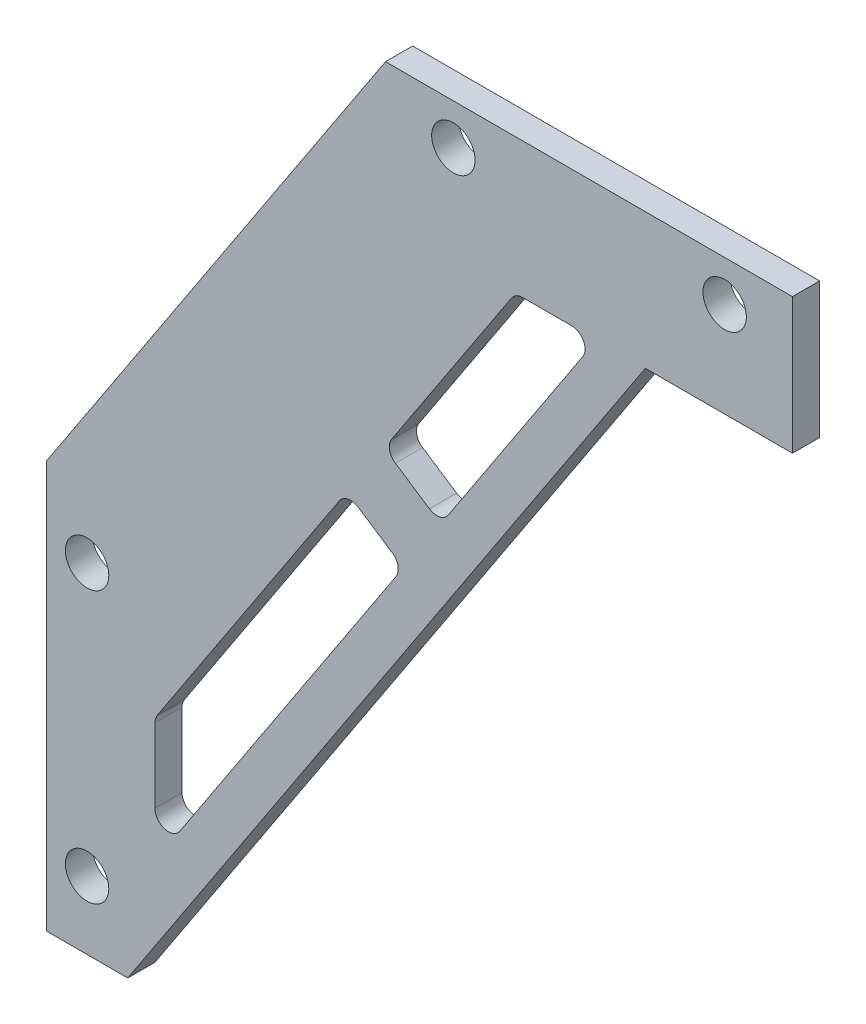
ISO-10303-21;
HEADER;
FILE_DESCRIPTION(('STEP AP214'),'2;1');
FILE_NAME('part.step','',(''),(''),'','','');
FILE_SCHEMA(('AUTOMOTIVE_DESIGN { 1 0 10303 214 1 1 1 1 }'));
ENDSEC;
DATA;
#1=APPLICATION_CONTEXT('core data for automotive mechanical design processes');
#2=APPLICATION_PROTOCOL_DEFINITION('international standard','automotive_design',2000,#1);
#3=PRODUCT_CONTEXT('',#1,'mechanical');
#4=PRODUCT('Part','Part','',(#3));
#5=PRODUCT_RELATED_PRODUCT_CATEGORY('part','',(#4));
#6=PRODUCT_DEFINITION_FORMATION('','',#4);
#7=PRODUCT_DEFINITION_CONTEXT('part definition',#1,'design');
#8=PRODUCT_DEFINITION('design','',#6,#7);
#9=PRODUCT_DEFINITION_SHAPE('','',#8);
#10=(LENGTH_UNIT() NAMED_UNIT(*) SI_UNIT(.MILLI.,.METRE.));
#11=(NAMED_UNIT(*) PLANE_ANGLE_UNIT() SI_UNIT($,.RADIAN.));
#12=(NAMED_UNIT(*) SI_UNIT($,.STERADIAN.) SOLID_ANGLE_UNIT());
#13=UNCERTAINTY_MEASURE_WITH_UNIT(LENGTH_MEASURE(1.E-05),#10,'distance_accuracy_value','');
#14=(GEOMETRIC_REPRESENTATION_CONTEXT(3) GLOBAL_UNCERTAINTY_ASSIGNED_CONTEXT((#13)) GLOBAL_UNIT_ASSIGNED_CONTEXT((#10,
#11,#12)) REPRESENTATION_CONTEXT('',''));
#15=CARTESIAN_POINT('',(0.,0.,0.));
#16=DIRECTION('',(0.,0.,1.));
#17=DIRECTION('',(1.,0.,0.));
#18=AXIS2_PLACEMENT_3D('',#15,#16,#17);
#19=CARTESIAN_POINT('',(0.,0.,2.));
#20=DIRECTION('',(0.,0.,-1.));
#21=DIRECTION('',(-1.,0.,0.));
#22=AXIS2_PLACEMENT_3D('',#19,#20,#21);
#23=PLANE('',#22);
#24=DIRECTION('',(0.549616501476276,0.83541708224394,0.));
#25=VECTOR('',#24,1.);
#26=CARTESIAN_POINT('',(39.5473895388569,56.4503834985237,2.));
#27=LINE('',#26,#25);
#28=CARTESIAN_POINT('',(29.6216111353899,41.3632003252538,2.));
#29=VERTEX_POINT('',#28);
#30=CARTESIAN_POINT('',(39.5473895388569,56.4503834985237,2.));
#31=VERTEX_POINT('',#30);
#32=EDGE_CURVE('E233',#29,#31,#27,.T.);
#33=ORIENTED_EDGE('',*,*,#32,.F.);
#34=CARTESIAN_POINT('',(28.7861940531459,41.9128168267301,2.));
#35=DIRECTION('',(0.,0.,1.));
#36=DIRECTION('',(1.,0.,0.));
#37=AXIS2_PLACEMENT_3D('',#34,#35,#36);
#38=CIRCLE('',#37,0.999999999999998);
#39=CARTESIAN_POINT('',(28.2365775516697,41.0773997444862,2.));
#40=VERTEX_POINT('',#39);
#41=EDGE_CURVE('E51',#40,#29,#38,.T.);
#42=ORIENTED_EDGE('',*,*,#41,.F.);
#43=DIRECTION('',(0.835417082243941,-0.549616501476275,0.));
#44=VECTOR('',#43,1.);
#45=CARTESIAN_POINT('',(25.7303263049378,42.726249248915,2.));
#46=LINE('',#45,#44);
#47=CARTESIAN_POINT('',(25.7303263049378,42.726249248915,2.));
#48=VERTEX_POINT('',#47);
#49=EDGE_CURVE('E213',#48,#40,#46,.T.);
#50=ORIENTED_EDGE('',*,*,#49,.F.);
#51=CARTESIAN_POINT('',(26.2799428064141,43.5616663311589,2.));
#52=DIRECTION('',(0.,0.,1.));
#53=DIRECTION('',(-1.,0.,0.));
#54=AXIS2_PLACEMENT_3D('',#51,#52,#53);
#55=CIRCLE('',#54,1.);
#56=CARTESIAN_POINT('',(25.4445257241702,44.1112828326352,2.));
#57=VERTEX_POINT('',#56);
#58=EDGE_CURVE('E216',#57,#48,#55,.T.);
#59=ORIENTED_EDGE('',*,*,#58,.F.);
#60=DIRECTION('',(-0.549616501476276,-0.835417082243941,0.));
#61=VECTOR('',#60,1.);
#62=CARTESIAN_POINT('',(25.4445257241702,44.1112828326352,2.));
#63=LINE('',#62,#61);
#64=CARTESIAN_POINT('',(34.2855347168287,57.5496165014763,2.));
#65=VERTEX_POINT('',#64);
#66=EDGE_CURVE('E245',#65,#57,#63,.T.);
#67=ORIENTED_EDGE('',*,*,#66,.F.);
#68=CARTESIAN_POINT('',(35.1209517990727,57.,2.));
#69=DIRECTION('',(0.,0.,1.));
#70=DIRECTION('',(1.,0.,0.));
#71=AXIS2_PLACEMENT_3D('',#68,#69,#70);
#72=CIRCLE('',#71,1.);
#73=CARTESIAN_POINT('',(35.1209517990727,58.,2.));
#74=VERTEX_POINT('',#73);
#75=EDGE_CURVE('E242',#74,#65,#72,.T.);
#76=ORIENTED_EDGE('',*,*,#75,.F.);
#77=DIRECTION('',(-1.,0.,0.));
#78=VECTOR('',#77,1.);
#79=CARTESIAN_POINT('',(35.1209517990727,58.,2.));
#80=LINE('',#79,#78);
#81=CARTESIAN_POINT('',(38.7119724566129,58.,2.));
#82=VERTEX_POINT('',#81);
#83=EDGE_CURVE('E239',#82,#74,#80,.T.);
#84=ORIENTED_EDGE('',*,*,#83,.F.);
#85=CARTESIAN_POINT('',(38.7119724566129,57.,2.));
#86=DIRECTION('',(0.,0.,1.));
#87=DIRECTION('',(-1.,0.,0.));
#88=AXIS2_PLACEMENT_3D('',#85,#86,#87);
#89=CIRCLE('',#88,1.00000000000001);
#90=EDGE_CURVE('E236',#31,#82,#89,.T.);
#91=ORIENTED_EDGE('',*,*,#90,.F.);
#92=EDGE_LOOP('',(#33,#42,#50,#59,#67,#76,#84,#91));
#93=FACE_BOUND('',#92,.T.);
#94=DIRECTION('',(0.,-1.,0.));
#95=VECTOR('',#94,1.);
#96=CARTESIAN_POINT('',(8.,11.8378018659482,2.));
#97=LINE('',#96,#95);
#98=CARTESIAN_POINT('',(8.,17.2961532654095,2.));
#99=VERTEX_POINT('',#98);
#100=CARTESIAN_POINT('',(8.,11.8378018659482,2.));
#101=VERTEX_POINT('',#100);
#102=EDGE_CURVE('E291',#99,#101,#97,.T.);
#103=ORIENTED_EDGE('',*,*,#102,.F.);
#104=CARTESIAN_POINT('',(9.,17.2961532654095,2.));
#105=DIRECTION('',(0.,0.,1.));
#106=DIRECTION('',(-1.,0.,0.));
#107=AXIS2_PLACEMENT_3D('',#104,#105,#106);
#108=CIRCLE('',#107,0.999999999999999);
#109=CARTESIAN_POINT('',(8.16458291775606,17.8457697668857,2.));
#110=VERTEX_POINT('',#109);
#111=EDGE_CURVE('E59',#110,#99,#108,.T.);
#112=ORIENTED_EDGE('',*,*,#111,.F.);
#113=DIRECTION('',(-0.549616501476276,-0.835417082243941,0.));
#114=VECTOR('',#113,1.);
#115=CARTESIAN_POINT('',(8.16458291775606,17.8457697668857,2.));
#116=LINE('',#115,#114);
#117=CARTESIAN_POINT('',(21.5972102138362,38.2633632569276,2.));
#118=VERTEX_POINT('',#117);
#119=EDGE_CURVE('E268',#118,#110,#116,.T.);
#120=ORIENTED_EDGE('',*,*,#119,.F.);
#121=CARTESIAN_POINT('',(22.4326272960802,37.7137467554513,2.));
#122=DIRECTION('',(0.,0.,1.));
#123=DIRECTION('',(1.,0.,0.));
#124=AXIS2_PLACEMENT_3D('',#121,#122,#123);
#125=CIRCLE('',#124,1.);
#126=CARTESIAN_POINT('',(22.9822437975565,38.5491638376953,2.));
#127=VERTEX_POINT('',#126);
#128=EDGE_CURVE('E306',#127,#118,#125,.T.);
#129=ORIENTED_EDGE('',*,*,#128,.F.);
#130=DIRECTION('',(-0.835417082243939,0.549616501476278,0.));
#131=VECTOR('',#130,1.);
#132=CARTESIAN_POINT('',(22.9822437975565,38.5491638376953,2.));
#133=LINE('',#132,#131);
#134=CARTESIAN_POINT('',(25.4884950442883,36.9003143332665,2.));
#135=VERTEX_POINT('',#134);
#136=EDGE_CURVE('E303',#135,#127,#133,.T.);
#137=ORIENTED_EDGE('',*,*,#136,.F.);
#138=CARTESIAN_POINT('',(24.938878542812,36.0648972510225,2.));
#139=DIRECTION('',(0.,0.,1.));
#140=DIRECTION('',(-1.,0.,0.));
#141=AXIS2_PLACEMENT_3D('',#138,#139,#140);
#142=CIRCLE('',#141,0.999999999999996);
#143=CARTESIAN_POINT('',(25.7742956250559,35.5152807495462,2.));
#144=VERTEX_POINT('',#143);
#145=EDGE_CURVE('E300',#144,#135,#142,.T.);
#146=ORIENTED_EDGE('',*,*,#145,.F.);
#147=DIRECTION('',(0.549616501476276,0.835417082243941,0.));
#148=VECTOR('',#147,1.);
#149=CARTESIAN_POINT('',(25.7742956250559,35.5152807495462,2.));
#150=LINE('',#149,#148);
#151=CARTESIAN_POINT('',(9.83541708224394,11.288185364472,2.));
#152=VERTEX_POINT('',#151);
#153=EDGE_CURVE('E297',#152,#144,#150,.T.);
#154=ORIENTED_EDGE('',*,*,#153,.F.);
#155=CARTESIAN_POINT('',(9.,11.8378018659482,2.));
#156=DIRECTION('',(0.,0.,1.));
#157=DIRECTION('',(-1.,0.,0.));
#158=AXIS2_PLACEMENT_3D('',#155,#156,#157);
#159=CIRCLE('',#158,1.);
#160=EDGE_CURVE('E294',#101,#152,#159,.T.);
#161=ORIENTED_EDGE('',*,*,#160,.F.);
#162=EDGE_LOOP('',(#103,#112,#120,#129,#137,#146,#154,#161));
#163=FACE_BOUND('',#162,.T.);
#164=DIRECTION('',(1.,0.,0.));
#165=VECTOR('',#164,1.);
#166=CARTESIAN_POINT('',(6.,0.,2.));
#167=LINE('',#166,#165);
#168=CARTESIAN_POINT('',(0.,0.,2.));
#169=VERTEX_POINT('',#168);
#170=CARTESIAN_POINT('',(6.,0.,2.));
#171=VERTEX_POINT('',#170);
#172=EDGE_CURVE('E349',#169,#171,#167,.T.);
#173=ORIENTED_EDGE('',*,*,#172,.T.);
#174=DIRECTION('',(0.549616501476276,0.83541708224394,0.));
#175=VECTOR('',#174,1.);
#176=CARTESIAN_POINT('',(44.1578947368421,58.,2.));
#177=LINE('',#176,#175);
#178=CARTESIAN_POINT('',(44.1578947368421,58.,2.));
#179=VERTEX_POINT('',#178);
#180=EDGE_CURVE('E352',#171,#179,#177,.T.);
#181=ORIENTED_EDGE('',*,*,#180,.T.);
#182=DIRECTION('',(1.,0.,0.));
#183=VECTOR('',#182,1.);
#184=CARTESIAN_POINT('',(55.,58.,2.));
#185=LINE('',#184,#183);
#186=CARTESIAN_POINT('',(55.,58.,2.));
#187=VERTEX_POINT('',#186);
#188=EDGE_CURVE('E355',#179,#187,#185,.T.);
#189=ORIENTED_EDGE('',*,*,#188,.T.);
#190=DIRECTION('',(0.,1.,0.));
#191=VECTOR('',#190,1.);
#192=CARTESIAN_POINT('',(55.,68.,2.));
#193=LINE('',#192,#191);
#194=CARTESIAN_POINT('',(55.,68.,2.));
#195=VERTEX_POINT('',#194);
#196=EDGE_CURVE('E357',#187,#195,#193,.T.);
#197=ORIENTED_EDGE('',*,*,#196,.T.);
#198=DIRECTION('',(-1.,0.,0.));
#199=VECTOR('',#198,1.);
#200=CARTESIAN_POINT('',(25.,68.,2.));
#201=LINE('',#200,#199);
#202=CARTESIAN_POINT('',(25.,68.,2.));
#203=VERTEX_POINT('',#202);
#204=EDGE_CURVE('E359',#195,#203,#201,.T.);
#205=ORIENTED_EDGE('',*,*,#204,.T.);
#206=DIRECTION('',(-0.549616501476276,-0.83541708224394,0.));
#207=VECTOR('',#206,1.);
#208=CARTESIAN_POINT('',(0.,30.,2.));
#209=LINE('',#208,#207);
#210=CARTESIAN_POINT('',(0.,30.,2.));
#211=VERTEX_POINT('',#210);
#212=EDGE_CURVE('E361',#203,#211,#209,.T.);
#213=ORIENTED_EDGE('',*,*,#212,.T.);
#214=DIRECTION('',(0.,-1.,0.));
#215=VECTOR('',#214,1.);
#216=CARTESIAN_POINT('',(0.,0.,2.));
#217=LINE('',#216,#215);
#218=EDGE_CURVE('E363',#211,#169,#217,.T.);
#219=ORIENTED_EDGE('',*,*,#218,.T.);
#220=EDGE_LOOP('',(#173,#181,#189,#197,#205,#213,#219));
#221=FACE_BOUND('',#220,.T.);
#222=CARTESIAN_POINT('',(3.,25.,2.));
#223=DIRECTION('',(0.,0.,1.));
#224=DIRECTION('',(1.,0.,0.));
#225=AXIS2_PLACEMENT_3D('',#222,#223,#224);
#226=CIRCLE('',#225,1.6);
#227=CARTESIAN_POINT('',(4.6,25.,2.));
#228=VERTEX_POINT('',#227);
#229=EDGE_CURVE('E343',#228,#228,#226,.T.);
#230=ORIENTED_EDGE('',*,*,#229,.F.);
#231=EDGE_LOOP('',(#230));
#232=FACE_BOUND('',#231,.T.);
#233=CARTESIAN_POINT('',(3.,5.,2.));
#234=DIRECTION('',(0.,0.,1.));
#235=DIRECTION('',(1.,0.,0.));
#236=AXIS2_PLACEMENT_3D('',#233,#234,#235);
#237=CIRCLE('',#236,1.6);
#238=CARTESIAN_POINT('',(4.6,5.,2.));
#239=VERTEX_POINT('',#238);
#240=EDGE_CURVE('E337',#239,#239,#237,.T.);
#241=ORIENTED_EDGE('',*,*,#240,.F.);
#242=EDGE_LOOP('',(#241));
#243=FACE_BOUND('',#242,.T.);
#244=CARTESIAN_POINT('',(30.,65.,2.));
#245=DIRECTION('',(0.,0.,1.));
#246=DIRECTION('',(1.,0.,0.));
#247=AXIS2_PLACEMENT_3D('',#244,#245,#246);
#248=CIRCLE('',#247,1.60000000000002);
#249=CARTESIAN_POINT('',(31.6,65.,2.));
#250=VERTEX_POINT('',#249);
#251=EDGE_CURVE('E331',#250,#250,#248,.T.);
#252=ORIENTED_EDGE('',*,*,#251,.F.);
#253=EDGE_LOOP('',(#252));
#254=FACE_BOUND('',#253,.T.);
#255=CARTESIAN_POINT('',(50.,65.,2.));
#256=DIRECTION('',(0.,0.,1.));
#257=DIRECTION('',(1.,0.,0.));
#258=AXIS2_PLACEMENT_3D('',#255,#256,#257);
#259=CIRCLE('',#258,1.6);
#260=CARTESIAN_POINT('',(51.6,65.,2.));
#261=VERTEX_POINT('',#260);
#262=EDGE_CURVE('E325',#261,#261,#259,.T.);
#263=ORIENTED_EDGE('',*,*,#262,.F.);
#264=EDGE_LOOP('',(#263));
#265=FACE_BOUND('',#264,.T.);
#266=ADVANCED_FACE('F36',(#93,#163,#221,#232,#243,#254,#265),#23,.F.);
#267=CARTESIAN_POINT('',(0.,0.,0.));
#268=DIRECTION('',(0.,0.,-1.));
#269=DIRECTION('',(-1.,0.,0.));
#270=AXIS2_PLACEMENT_3D('',#267,#268,#269);
#271=PLANE('',#270);
#272=CARTESIAN_POINT('',(28.7861940531459,41.9128168267301,0.));
#273=DIRECTION('',(0.,0.,1.));
#274=DIRECTION('',(1.,0.,0.));
#275=AXIS2_PLACEMENT_3D('',#272,#273,#274);
#276=CIRCLE('',#275,0.999999999999998);
#277=CARTESIAN_POINT('',(28.2365775516697,41.0773997444862,0.));
#278=VERTEX_POINT('',#277);
#279=CARTESIAN_POINT('',(29.6216111353899,41.3632003252538,0.));
#280=VERTEX_POINT('',#279);
#281=EDGE_CURVE('E193',#278,#280,#276,.T.);
#282=ORIENTED_EDGE('',*,*,#281,.T.);
#283=DIRECTION('',(0.549616501476276,0.83541708224394,0.));
#284=VECTOR('',#283,1.);
#285=CARTESIAN_POINT('',(39.5473895388569,56.4503834985237,0.));
#286=LINE('',#285,#284);
#287=CARTESIAN_POINT('',(39.5473895388569,56.4503834985237,0.));
#288=VERTEX_POINT('',#287);
#289=EDGE_CURVE('E203',#280,#288,#286,.T.);
#290=ORIENTED_EDGE('',*,*,#289,.T.);
#291=CARTESIAN_POINT('',(38.7119724566129,57.,0.));
#292=DIRECTION('',(0.,0.,1.));
#293=DIRECTION('',(-1.,0.,0.));
#294=AXIS2_PLACEMENT_3D('',#291,#292,#293);
#295=CIRCLE('',#294,1.00000000000001);
#296=CARTESIAN_POINT('',(38.7119724566129,58.,0.));
#297=VERTEX_POINT('',#296);
#298=EDGE_CURVE('E207',#288,#297,#295,.T.);
#299=ORIENTED_EDGE('',*,*,#298,.T.);
#300=DIRECTION('',(-1.,0.,0.));
#301=VECTOR('',#300,1.);
#302=CARTESIAN_POINT('',(35.1209517990727,58.,0.));
#303=LINE('',#302,#301);
#304=CARTESIAN_POINT('',(35.1209517990727,58.,0.));
#305=VERTEX_POINT('',#304);
#306=EDGE_CURVE('E220',#297,#305,#303,.T.);
#307=ORIENTED_EDGE('',*,*,#306,.T.);
#308=CARTESIAN_POINT('',(35.1209517990727,57.,0.));
#309=DIRECTION('',(0.,0.,1.));
#310=DIRECTION('',(1.,0.,0.));
#311=AXIS2_PLACEMENT_3D('',#308,#309,#310);
#312=CIRCLE('',#311,1.);
#313=CARTESIAN_POINT('',(34.2855347168287,57.5496165014763,0.));
#314=VERTEX_POINT('',#313);
#315=EDGE_CURVE('E223',#305,#314,#312,.T.);
#316=ORIENTED_EDGE('',*,*,#315,.T.);
#317=DIRECTION('',(-0.549616501476276,-0.835417082243941,0.));
#318=VECTOR('',#317,1.);
#319=CARTESIAN_POINT('',(25.4445257241702,44.1112828326352,0.));
#320=LINE('',#319,#318);
#321=CARTESIAN_POINT('',(25.4445257241702,44.1112828326352,0.));
#322=VERTEX_POINT('',#321);
#323=EDGE_CURVE('E226',#314,#322,#320,.T.);
#324=ORIENTED_EDGE('',*,*,#323,.T.);
#325=CARTESIAN_POINT('',(26.2799428064141,43.5616663311589,0.));
#326=DIRECTION('',(0.,0.,1.));
#327=DIRECTION('',(-1.,0.,0.));
#328=AXIS2_PLACEMENT_3D('',#325,#326,#327);
#329=CIRCLE('',#328,1.);
#330=CARTESIAN_POINT('',(25.7303263049378,42.726249248915,0.));
#331=VERTEX_POINT('',#330);
#332=EDGE_CURVE('E229',#322,#331,#329,.T.);
#333=ORIENTED_EDGE('',*,*,#332,.T.);
#334=DIRECTION('',(0.835417082243941,-0.549616501476275,0.));
#335=VECTOR('',#334,1.);
#336=CARTESIAN_POINT('',(25.7303263049378,42.726249248915,0.));
#337=LINE('',#336,#335);
#338=EDGE_CURVE('E199',#331,#278,#337,.T.);
#339=ORIENTED_EDGE('',*,*,#338,.T.);
#340=EDGE_LOOP('',(#282,#290,#299,#307,#316,#324,#333,#339));
#341=FACE_BOUND('',#340,.T.);
#342=CARTESIAN_POINT('',(9.,17.2961532654095,0.));
#343=DIRECTION('',(0.,0.,1.));
#344=DIRECTION('',(-1.,0.,0.));
#345=AXIS2_PLACEMENT_3D('',#342,#343,#344);
#346=CIRCLE('',#345,0.999999999999999);
#347=CARTESIAN_POINT('',(8.16458291775606,17.8457697668857,0.));
#348=VERTEX_POINT('',#347);
#349=CARTESIAN_POINT('',(8.,17.2961532654095,0.));
#350=VERTEX_POINT('',#349);
#351=EDGE_CURVE('E264',#348,#350,#346,.T.);
#352=ORIENTED_EDGE('',*,*,#351,.T.);
#353=DIRECTION('',(0.,-1.,0.));
#354=VECTOR('',#353,1.);
#355=CARTESIAN_POINT('',(8.,11.8378018659482,0.));
#356=LINE('',#355,#354);
#357=CARTESIAN_POINT('',(8.,11.8378018659482,0.));
#358=VERTEX_POINT('',#357);
#359=EDGE_CURVE('E267',#350,#358,#356,.T.);
#360=ORIENTED_EDGE('',*,*,#359,.T.);
#361=CARTESIAN_POINT('',(9.,11.8378018659482,0.));
#362=DIRECTION('',(0.,0.,1.));
#363=DIRECTION('',(-1.,0.,0.));
#364=AXIS2_PLACEMENT_3D('',#361,#362,#363);
#365=CIRCLE('',#364,1.);
#366=CARTESIAN_POINT('',(9.83541708224394,11.288185364472,0.));
#367=VERTEX_POINT('',#366);
#368=EDGE_CURVE('E271',#358,#367,#365,.T.);
#369=ORIENTED_EDGE('',*,*,#368,.T.);
#370=DIRECTION('',(0.549616501476276,0.835417082243941,0.));
#371=VECTOR('',#370,1.);
#372=CARTESIAN_POINT('',(25.7742956250559,35.5152807495462,0.));
#373=LINE('',#372,#371);
#374=CARTESIAN_POINT('',(25.7742956250559,35.5152807495462,0.));
#375=VERTEX_POINT('',#374);
#376=EDGE_CURVE('E274',#367,#375,#373,.T.);
#377=ORIENTED_EDGE('',*,*,#376,.T.);
#378=CARTESIAN_POINT('',(24.938878542812,36.0648972510225,0.));
#379=DIRECTION('',(0.,0.,1.));
#380=DIRECTION('',(-1.,0.,0.));
#381=AXIS2_PLACEMENT_3D('',#378,#379,#380);
#382=CIRCLE('',#381,0.999999999999996);
#383=CARTESIAN_POINT('',(25.4884950442883,36.9003143332665,0.));
#384=VERTEX_POINT('',#383);
#385=EDGE_CURVE('E277',#375,#384,#382,.T.);
#386=ORIENTED_EDGE('',*,*,#385,.T.);
#387=DIRECTION('',(-0.835417082243939,0.549616501476278,0.));
#388=VECTOR('',#387,1.);
#389=CARTESIAN_POINT('',(22.9822437975565,38.5491638376953,0.));
#390=LINE('',#389,#388);
#391=CARTESIAN_POINT('',(22.9822437975565,38.5491638376953,0.));
#392=VERTEX_POINT('',#391);
#393=EDGE_CURVE('E280',#384,#392,#390,.T.);
#394=ORIENTED_EDGE('',*,*,#393,.T.);
#395=CARTESIAN_POINT('',(22.4326272960802,37.7137467554513,0.));
#396=DIRECTION('',(0.,0.,1.));
#397=DIRECTION('',(1.,0.,0.));
#398=AXIS2_PLACEMENT_3D('',#395,#396,#397);
#399=CIRCLE('',#398,1.);
#400=CARTESIAN_POINT('',(21.5972102138362,38.2633632569276,0.));
#401=VERTEX_POINT('',#400);
#402=EDGE_CURVE('E283',#392,#401,#399,.T.);
#403=ORIENTED_EDGE('',*,*,#402,.T.);
#404=DIRECTION('',(-0.549616501476276,-0.835417082243941,0.));
#405=VECTOR('',#404,1.);
#406=CARTESIAN_POINT('',(8.16458291775606,17.8457697668857,0.));
#407=LINE('',#406,#405);
#408=EDGE_CURVE('E286',#401,#348,#407,.T.);
#409=ORIENTED_EDGE('',*,*,#408,.T.);
#410=EDGE_LOOP('',(#352,#360,#369,#377,#386,#394,#403,#409));
#411=FACE_BOUND('',#410,.T.);
#412=CARTESIAN_POINT('',(30.,65.,0.));
#413=DIRECTION('',(0.,0.,1.));
#414=DIRECTION('',(1.,0.,0.));
#415=AXIS2_PLACEMENT_3D('',#412,#413,#414);
#416=CIRCLE('',#415,1.60000000000002);
#417=CARTESIAN_POINT('',(31.6,65.,0.));
#418=VERTEX_POINT('',#417);
#419=EDGE_CURVE('E328',#418,#418,#416,.T.);
#420=ORIENTED_EDGE('',*,*,#419,.T.);
#421=EDGE_LOOP('',(#420));
#422=FACE_BOUND('',#421,.T.);
#423=CARTESIAN_POINT('',(3.,25.,0.));
#424=DIRECTION('',(0.,0.,1.));
#425=DIRECTION('',(1.,0.,0.));
#426=AXIS2_PLACEMENT_3D('',#423,#424,#425);
#427=CIRCLE('',#426,1.6);
#428=CARTESIAN_POINT('',(4.6,25.,0.));
#429=VERTEX_POINT('',#428);
#430=EDGE_CURVE('E340',#429,#429,#427,.T.);
#431=ORIENTED_EDGE('',*,*,#430,.T.);
#432=EDGE_LOOP('',(#431));
#433=FACE_BOUND('',#432,.T.);
#434=DIRECTION('',(1.,0.,0.));
#435=VECTOR('',#434,1.);
#436=CARTESIAN_POINT('',(6.,0.,0.));
#437=LINE('',#436,#435);
#438=CARTESIAN_POINT('',(0.,0.,0.));
#439=VERTEX_POINT('',#438);
#440=CARTESIAN_POINT('',(6.,0.,0.));
#441=VERTEX_POINT('',#440);
#442=EDGE_CURVE('E346',#439,#441,#437,.T.);
#443=ORIENTED_EDGE('',*,*,#442,.F.);
#444=DIRECTION('',(0.,-1.,0.));
#445=VECTOR('',#444,1.);
#446=CARTESIAN_POINT('',(0.,0.,0.));
#447=LINE('',#446,#445);
#448=CARTESIAN_POINT('',(0.,30.,0.));
#449=VERTEX_POINT('',#448);
#450=EDGE_CURVE('E353',#449,#439,#447,.T.);
#451=ORIENTED_EDGE('',*,*,#450,.F.);
#452=DIRECTION('',(-0.549616501476276,-0.83541708224394,0.));
#453=VECTOR('',#452,1.);
#454=CARTESIAN_POINT('',(0.,30.,0.));
#455=LINE('',#454,#453);
#456=CARTESIAN_POINT('',(25.,68.,0.));
#457=VERTEX_POINT('',#456);
#458=EDGE_CURVE('E376',#457,#449,#455,.T.);
#459=ORIENTED_EDGE('',*,*,#458,.F.);
#460=DIRECTION('',(-1.,0.,0.));
#461=VECTOR('',#460,1.);
#462=CARTESIAN_POINT('',(25.,68.,0.));
#463=LINE('',#462,#461);
#464=CARTESIAN_POINT('',(55.,68.,0.));
#465=VERTEX_POINT('',#464);
#466=EDGE_CURVE('E374',#465,#457,#463,.T.);
#467=ORIENTED_EDGE('',*,*,#466,.F.);
#468=DIRECTION('',(0.,1.,0.));
#469=VECTOR('',#468,1.);
#470=CARTESIAN_POINT('',(55.,68.,0.));
#471=LINE('',#470,#469);
#472=CARTESIAN_POINT('',(55.,58.,0.));
#473=VERTEX_POINT('',#472);
#474=EDGE_CURVE('E372',#473,#465,#471,.T.);
#475=ORIENTED_EDGE('',*,*,#474,.F.);
#476=DIRECTION('',(1.,0.,0.));
#477=VECTOR('',#476,1.);
#478=CARTESIAN_POINT('',(55.,58.,0.));
#479=LINE('',#478,#477);
#480=CARTESIAN_POINT('',(44.1578947368421,58.,0.));
#481=VERTEX_POINT('',#480);
#482=EDGE_CURVE('E370',#481,#473,#479,.T.);
#483=ORIENTED_EDGE('',*,*,#482,.F.);
#484=DIRECTION('',(0.549616501476276,0.83541708224394,0.));
#485=VECTOR('',#484,1.);
#486=CARTESIAN_POINT('',(44.1578947368421,58.,0.));
#487=LINE('',#486,#485);
#488=EDGE_CURVE('E368',#441,#481,#487,.T.);
#489=ORIENTED_EDGE('',*,*,#488,.F.);
#490=EDGE_LOOP('',(#443,#451,#459,#467,#475,#483,#489));
#491=FACE_BOUND('',#490,.T.);
#492=CARTESIAN_POINT('',(3.,5.,0.));
#493=DIRECTION('',(0.,0.,1.));
#494=DIRECTION('',(1.,0.,0.));
#495=AXIS2_PLACEMENT_3D('',#492,#493,#494);
#496=CIRCLE('',#495,1.6);
#497=CARTESIAN_POINT('',(4.6,5.,0.));
#498=VERTEX_POINT('',#497);
#499=EDGE_CURVE('E334',#498,#498,#496,.T.);
#500=ORIENTED_EDGE('',*,*,#499,.T.);
#501=EDGE_LOOP('',(#500));
#502=FACE_BOUND('',#501,.T.);
#503=CARTESIAN_POINT('',(50.,65.,0.));
#504=DIRECTION('',(0.,0.,1.));
#505=DIRECTION('',(1.,0.,0.));
#506=AXIS2_PLACEMENT_3D('',#503,#504,#505);
#507=CIRCLE('',#506,1.6);
#508=CARTESIAN_POINT('',(51.6,65.,0.));
#509=VERTEX_POINT('',#508);
#510=EDGE_CURVE('E252',#509,#509,#507,.T.);
#511=ORIENTED_EDGE('',*,*,#510,.T.);
#512=EDGE_LOOP('',(#511));
#513=FACE_BOUND('',#512,.T.);
#514=ADVANCED_FACE('F209',(#341,#411,#422,#433,#491,#502,#513),#271,.T.);
#515=CARTESIAN_POINT('',(6.,0.,2.));
#516=DIRECTION('',(0.,1.,0.));
#517=DIRECTION('',(-1.,0.,0.));
#518=AXIS2_PLACEMENT_3D('',#515,#516,#517);
#519=PLANE('',#518);
#520=ORIENTED_EDGE('',*,*,#442,.T.);
#521=DIRECTION('',(0.,0.,-1.));
#522=VECTOR('',#521,1.);
#523=CARTESIAN_POINT('',(6.,0.,2.));
#524=LINE('',#523,#522);
#525=EDGE_CURVE('E11',#171,#441,#524,.T.);
#526=ORIENTED_EDGE('',*,*,#525,.F.);
#527=ORIENTED_EDGE('',*,*,#172,.F.);
#528=DIRECTION('',(0.,0.,-1.));
#529=VECTOR('',#528,1.);
#530=CARTESIAN_POINT('',(0.,0.,2.));
#531=LINE('',#530,#529);
#532=EDGE_CURVE('E365',#169,#439,#531,.T.);
#533=ORIENTED_EDGE('',*,*,#532,.T.);
#534=EDGE_LOOP('',(#520,#526,#527,#533));
#535=FACE_BOUND('',#534,.T.);
#536=ADVANCED_FACE('F38',(#535),#519,.F.);
#537=CARTESIAN_POINT('',(44.1578947368421,58.,2.));
#538=DIRECTION('',(-0.83541708224394,0.549616501476276,0.));
#539=DIRECTION('',(-0.549616501476276,-0.83541708224394,0.));
#540=AXIS2_PLACEMENT_3D('',#537,#538,#539);
#541=PLANE('',#540);
#542=ORIENTED_EDGE('',*,*,#488,.T.);
#543=DIRECTION('',(0.,0.,-1.));
#544=VECTOR('',#543,1.);
#545=CARTESIAN_POINT('',(44.1578947368421,58.,2.));
#546=LINE('',#545,#544);
#547=EDGE_CURVE('E44',#179,#481,#546,.T.);
#548=ORIENTED_EDGE('',*,*,#547,.F.);
#549=ORIENTED_EDGE('',*,*,#180,.F.);
#550=ORIENTED_EDGE('',*,*,#525,.T.);
#551=EDGE_LOOP('',(#542,#548,#549,#550));
#552=FACE_BOUND('',#551,.T.);
#553=ADVANCED_FACE('F420',(#552),#541,.F.);
#554=CARTESIAN_POINT('',(55.,58.,2.));
#555=DIRECTION('',(0.,1.,0.));
#556=DIRECTION('',(-1.,0.,0.));
#557=AXIS2_PLACEMENT_3D('',#554,#555,#556);
#558=PLANE('',#557);
#559=ORIENTED_EDGE('',*,*,#482,.T.);
#560=DIRECTION('',(0.,0.,-1.));
#561=VECTOR('',#560,1.);
#562=CARTESIAN_POINT('',(55.,58.,2.));
#563=LINE('',#562,#561);
#564=EDGE_CURVE('E390',#187,#473,#563,.T.);
#565=ORIENTED_EDGE('',*,*,#564,.F.);
#566=ORIENTED_EDGE('',*,*,#188,.F.);
#567=ORIENTED_EDGE('',*,*,#547,.T.);
#568=EDGE_LOOP('',(#559,#565,#566,#567));
#569=FACE_BOUND('',#568,.T.);
#570=ADVANCED_FACE('F397',(#569),#558,.F.);
#571=CARTESIAN_POINT('',(55.,68.,2.));
#572=DIRECTION('',(-1.,0.,0.));
#573=DIRECTION('',(0.,0.,1.));
#574=AXIS2_PLACEMENT_3D('',#571,#572,#573);
#575=PLANE('',#574);
#576=ORIENTED_EDGE('',*,*,#474,.T.);
#577=DIRECTION('',(0.,0.,-1.));
#578=VECTOR('',#577,1.);
#579=CARTESIAN_POINT('',(55.,68.,2.));
#580=LINE('',#579,#578);
#581=EDGE_CURVE('E387',#195,#465,#580,.T.);
#582=ORIENTED_EDGE('',*,*,#581,.F.);
#583=ORIENTED_EDGE('',*,*,#196,.F.);
#584=ORIENTED_EDGE('',*,*,#564,.T.);
#585=EDGE_LOOP('',(#576,#582,#583,#584));
#586=FACE_BOUND('',#585,.T.);
#587=ADVANCED_FACE('F408',(#586),#575,.F.);
#588=CARTESIAN_POINT('',(25.,68.,2.));
#589=DIRECTION('',(0.,-1.,0.));
#590=DIRECTION('',(1.,0.,0.));
#591=AXIS2_PLACEMENT_3D('',#588,#589,#590);
#592=PLANE('',#591);
#593=ORIENTED_EDGE('',*,*,#466,.T.);
#594=DIRECTION('',(0.,0.,-1.));
#595=VECTOR('',#594,1.);
#596=CARTESIAN_POINT('',(25.,68.,2.));
#597=LINE('',#596,#595);
#598=EDGE_CURVE('E384',#203,#457,#597,.T.);
#599=ORIENTED_EDGE('',*,*,#598,.F.);
#600=ORIENTED_EDGE('',*,*,#204,.F.);
#601=ORIENTED_EDGE('',*,*,#581,.T.);
#602=EDGE_LOOP('',(#593,#599,#600,#601));
#603=FACE_BOUND('',#602,.T.);
#604=ADVANCED_FACE('F412',(#603),#592,.F.);
#605=CARTESIAN_POINT('',(0.,30.,2.));
#606=DIRECTION('',(0.83541708224394,-0.549616501476276,0.));
#607=DIRECTION('',(0.549616501476276,0.83541708224394,0.));
#608=AXIS2_PLACEMENT_3D('',#605,#606,#607);
#609=PLANE('',#608);
#610=ORIENTED_EDGE('',*,*,#458,.T.);
#611=DIRECTION('',(0.,0.,-1.));
#612=VECTOR('',#611,1.);
#613=CARTESIAN_POINT('',(0.,30.,2.));
#614=LINE('',#613,#612);
#615=EDGE_CURVE('E381',#211,#449,#614,.T.);
#616=ORIENTED_EDGE('',*,*,#615,.F.);
#617=ORIENTED_EDGE('',*,*,#212,.F.);
#618=ORIENTED_EDGE('',*,*,#598,.T.);
#619=EDGE_LOOP('',(#610,#616,#617,#618));
#620=FACE_BOUND('',#619,.T.);
#621=ADVANCED_FACE('F428',(#620),#609,.F.);
#622=CARTESIAN_POINT('',(0.,0.,2.));
#623=DIRECTION('',(1.,0.,0.));
#624=DIRECTION('',(0.,0.,-1.));
#625=AXIS2_PLACEMENT_3D('',#622,#623,#624);
#626=PLANE('',#625);
#627=ORIENTED_EDGE('',*,*,#450,.T.);
#628=ORIENTED_EDGE('',*,*,#532,.F.);
#629=ORIENTED_EDGE('',*,*,#218,.F.);
#630=ORIENTED_EDGE('',*,*,#615,.T.);
#631=EDGE_LOOP('',(#627,#628,#629,#630));
#632=FACE_BOUND('',#631,.T.);
#633=ADVANCED_FACE('F425',(#632),#626,.F.);
#634=CARTESIAN_POINT('',(3.,25.,2.));
#635=DIRECTION('',(0.,0.,-1.));
#636=DIRECTION('',(-1.,0.,0.));
#637=AXIS2_PLACEMENT_3D('',#634,#635,#636);
#638=CYLINDRICAL_SURFACE('',#637,1.6);
#639=ORIENTED_EDGE('',*,*,#229,.T.);
#640=EDGE_LOOP('',(#639));
#641=FACE_BOUND('',#640,.T.);
#642=ORIENTED_EDGE('',*,*,#430,.F.);
#643=EDGE_LOOP('',(#642));
#644=FACE_BOUND('',#643,.T.);
#645=ADVANCED_FACE('F435',(#641,#644),#638,.F.);
#646=CARTESIAN_POINT('',(3.,5.,2.));
#647=DIRECTION('',(0.,0.,-1.));
#648=DIRECTION('',(-1.,0.,0.));
#649=AXIS2_PLACEMENT_3D('',#646,#647,#648);
#650=CYLINDRICAL_SURFACE('',#649,1.6);
#651=ORIENTED_EDGE('',*,*,#240,.T.);
#652=EDGE_LOOP('',(#651));
#653=FACE_BOUND('',#652,.T.);
#654=ORIENTED_EDGE('',*,*,#499,.F.);
#655=EDGE_LOOP('',(#654));
#656=FACE_BOUND('',#655,.T.);
#657=ADVANCED_FACE('F449',(#653,#656),#650,.F.);
#658=CARTESIAN_POINT('',(30.,65.,2.));
#659=DIRECTION('',(0.,0.,-1.));
#660=DIRECTION('',(-1.,0.,0.));
#661=AXIS2_PLACEMENT_3D('',#658,#659,#660);
#662=CYLINDRICAL_SURFACE('',#661,1.60000000000002);
#663=ORIENTED_EDGE('',*,*,#251,.T.);
#664=EDGE_LOOP('',(#663));
#665=FACE_BOUND('',#664,.T.);
#666=ORIENTED_EDGE('',*,*,#419,.F.);
#667=EDGE_LOOP('',(#666));
#668=FACE_BOUND('',#667,.T.);
#669=ADVANCED_FACE('F453',(#665,#668),#662,.F.);
#670=CARTESIAN_POINT('',(50.,65.,2.));
#671=DIRECTION('',(0.,0.,-1.));
#672=DIRECTION('',(-1.,0.,0.));
#673=AXIS2_PLACEMENT_3D('',#670,#671,#672);
#674=CYLINDRICAL_SURFACE('',#673,1.6);
#675=ORIENTED_EDGE('',*,*,#262,.T.);
#676=EDGE_LOOP('',(#675));
#677=FACE_BOUND('',#676,.T.);
#678=ORIENTED_EDGE('',*,*,#510,.F.);
#679=EDGE_LOOP('',(#678));
#680=FACE_BOUND('',#679,.T.);
#681=ADVANCED_FACE('F457',(#677,#680),#674,.F.);
#682=CARTESIAN_POINT('',(9.,17.2961532654095,0.));
#683=DIRECTION('',(0.,0.,1.));
#684=DIRECTION('',(1.,0.,0.));
#685=AXIS2_PLACEMENT_3D('',#682,#683,#684);
#686=CYLINDRICAL_SURFACE('',#685,0.999999999999999);
#687=ORIENTED_EDGE('',*,*,#111,.T.);
#688=DIRECTION('',(0.,0.,1.));
#689=VECTOR('',#688,1.);
#690=CARTESIAN_POINT('',(8.,17.2961532654095,0.));
#691=LINE('',#690,#689);
#692=EDGE_CURVE('E289',#350,#99,#691,.T.);
#693=ORIENTED_EDGE('',*,*,#692,.F.);
#694=ORIENTED_EDGE('',*,*,#351,.F.);
#695=DIRECTION('',(0.,0.,1.));
#696=VECTOR('',#695,1.);
#697=CARTESIAN_POINT('',(8.16458291775606,17.8457697668857,0.));
#698=LINE('',#697,#696);
#699=EDGE_CURVE('E234',#348,#110,#698,.T.);
#700=ORIENTED_EDGE('',*,*,#699,.T.);
#701=EDGE_LOOP('',(#687,#693,#694,#700));
#702=FACE_BOUND('',#701,.T.);
#703=ADVANCED_FACE('F461',(#702),#686,.F.);
#704=CARTESIAN_POINT('',(8.16458291775606,17.8457697668857,0.));
#705=DIRECTION('',(-0.835417082243941,0.549616501476276,0.));
#706=DIRECTION('',(-0.549616501476276,-0.835417082243941,0.));
#707=AXIS2_PLACEMENT_3D('',#704,#705,#706);
#708=PLANE('',#707);
#709=ORIENTED_EDGE('',*,*,#119,.T.);
#710=ORIENTED_EDGE('',*,*,#699,.F.);
#711=ORIENTED_EDGE('',*,*,#408,.F.);
#712=DIRECTION('',(0.,0.,1.));
#713=VECTOR('',#712,1.);
#714=CARTESIAN_POINT('',(21.5972102138362,38.2633632569276,0.));
#715=LINE('',#714,#713);
#716=EDGE_CURVE('E312',#401,#118,#715,.T.);
#717=ORIENTED_EDGE('',*,*,#716,.T.);
#718=EDGE_LOOP('',(#709,#710,#711,#717));
#719=FACE_BOUND('',#718,.T.);
#720=ADVANCED_FACE('F465',(#719),#708,.F.);
#721=CARTESIAN_POINT('',(22.4326272960802,37.7137467554513,0.));
#722=DIRECTION('',(0.,0.,1.));
#723=DIRECTION('',(1.,0.,0.));
#724=AXIS2_PLACEMENT_3D('',#721,#722,#723);
#725=CYLINDRICAL_SURFACE('',#724,1.);
#726=ORIENTED_EDGE('',*,*,#128,.T.);
#727=ORIENTED_EDGE('',*,*,#716,.F.);
#728=ORIENTED_EDGE('',*,*,#402,.F.);
#729=DIRECTION('',(0.,0.,1.));
#730=VECTOR('',#729,1.);
#731=CARTESIAN_POINT('',(22.9822437975565,38.5491638376953,0.));
#732=LINE('',#731,#730);
#733=EDGE_CURVE('E314',#392,#127,#732,.T.);
#734=ORIENTED_EDGE('',*,*,#733,.T.);
#735=EDGE_LOOP('',(#726,#727,#728,#734));
#736=FACE_BOUND('',#735,.T.);
#737=ADVANCED_FACE('F485',(#736),#725,.F.);
#738=CARTESIAN_POINT('',(22.9822437975565,38.5491638376953,0.));
#739=DIRECTION('',(0.549616501476278,0.835417082243939,0.));
#740=DIRECTION('',(-0.835417082243939,0.549616501476278,0.));
#741=AXIS2_PLACEMENT_3D('',#738,#739,#740);
#742=PLANE('',#741);
#743=ORIENTED_EDGE('',*,*,#136,.T.);
#744=ORIENTED_EDGE('',*,*,#733,.F.);
#745=ORIENTED_EDGE('',*,*,#393,.F.);
#746=DIRECTION('',(0.,0.,1.));
#747=VECTOR('',#746,1.);
#748=CARTESIAN_POINT('',(25.4884950442883,36.9003143332665,0.));
#749=LINE('',#748,#747);
#750=EDGE_CURVE('E316',#384,#135,#749,.T.);
#751=ORIENTED_EDGE('',*,*,#750,.T.);
#752=EDGE_LOOP('',(#743,#744,#745,#751));
#753=FACE_BOUND('',#752,.T.);
#754=ADVANCED_FACE('F481',(#753),#742,.F.);
#755=CARTESIAN_POINT('',(24.938878542812,36.0648972510225,0.));
#756=DIRECTION('',(0.,0.,1.));
#757=DIRECTION('',(1.,0.,0.));
#758=AXIS2_PLACEMENT_3D('',#755,#756,#757);
#759=CYLINDRICAL_SURFACE('',#758,0.999999999999996);
#760=ORIENTED_EDGE('',*,*,#145,.T.);
#761=ORIENTED_EDGE('',*,*,#750,.F.);
#762=ORIENTED_EDGE('',*,*,#385,.F.);
#763=DIRECTION('',(0.,0.,1.));
#764=VECTOR('',#763,1.);
#765=CARTESIAN_POINT('',(25.7742956250559,35.5152807495462,0.));
#766=LINE('',#765,#764);
#767=EDGE_CURVE('E318',#375,#144,#766,.T.);
#768=ORIENTED_EDGE('',*,*,#767,.T.);
#769=EDGE_LOOP('',(#760,#761,#762,#768));
#770=FACE_BOUND('',#769,.T.);
#771=ADVANCED_FACE('F477',(#770),#759,.F.);
#772=CARTESIAN_POINT('',(25.7742956250559,35.5152807495462,0.));
#773=DIRECTION('',(0.835417082243941,-0.549616501476276,0.));
#774=DIRECTION('',(0.549616501476276,0.835417082243941,0.));
#775=AXIS2_PLACEMENT_3D('',#772,#773,#774);
#776=PLANE('',#775);
#777=ORIENTED_EDGE('',*,*,#153,.T.);
#778=ORIENTED_EDGE('',*,*,#767,.F.);
#779=ORIENTED_EDGE('',*,*,#376,.F.);
#780=DIRECTION('',(0.,0.,1.));
#781=VECTOR('',#780,1.);
#782=CARTESIAN_POINT('',(9.83541708224394,11.288185364472,0.));
#783=LINE('',#782,#781);
#784=EDGE_CURVE('E320',#367,#152,#783,.T.);
#785=ORIENTED_EDGE('',*,*,#784,.T.);
#786=EDGE_LOOP('',(#777,#778,#779,#785));
#787=FACE_BOUND('',#786,.T.);
#788=ADVANCED_FACE('F473',(#787),#776,.F.);
#789=CARTESIAN_POINT('',(9.,11.8378018659482,0.));
#790=DIRECTION('',(0.,0.,1.));
#791=DIRECTION('',(1.,0.,0.));
#792=AXIS2_PLACEMENT_3D('',#789,#790,#791);
#793=CYLINDRICAL_SURFACE('',#792,1.);
#794=ORIENTED_EDGE('',*,*,#160,.T.);
#795=ORIENTED_EDGE('',*,*,#784,.F.);
#796=ORIENTED_EDGE('',*,*,#368,.F.);
#797=DIRECTION('',(0.,0.,1.));
#798=VECTOR('',#797,1.);
#799=CARTESIAN_POINT('',(8.,11.8378018659482,0.));
#800=LINE('',#799,#798);
#801=EDGE_CURVE('E322',#358,#101,#800,.T.);
#802=ORIENTED_EDGE('',*,*,#801,.T.);
#803=EDGE_LOOP('',(#794,#795,#796,#802));
#804=FACE_BOUND('',#803,.T.);
#805=ADVANCED_FACE('F469',(#804),#793,.F.);
#806=CARTESIAN_POINT('',(8.,11.8378018659482,0.));
#807=DIRECTION('',(-1.,0.,0.));
#808=DIRECTION('',(0.,0.,1.));
#809=AXIS2_PLACEMENT_3D('',#806,#807,#808);
#810=PLANE('',#809);
#811=ORIENTED_EDGE('',*,*,#102,.T.);
#812=ORIENTED_EDGE('',*,*,#801,.F.);
#813=ORIENTED_EDGE('',*,*,#359,.F.);
#814=ORIENTED_EDGE('',*,*,#692,.T.);
#815=EDGE_LOOP('',(#811,#812,#813,#814));
#816=FACE_BOUND('',#815,.T.);
#817=ADVANCED_FACE('F466',(#816),#810,.F.);
#818=CARTESIAN_POINT('',(28.7861940531459,41.9128168267301,0.));
#819=DIRECTION('',(0.,0.,1.));
#820=DIRECTION('',(1.,0.,0.));
#821=AXIS2_PLACEMENT_3D('',#818,#819,#820);
#822=CYLINDRICAL_SURFACE('',#821,0.999999999999998);
#823=ORIENTED_EDGE('',*,*,#41,.T.);
#824=DIRECTION('',(0.,0.,1.));
#825=VECTOR('',#824,1.);
#826=CARTESIAN_POINT('',(29.6216111353899,41.3632003252538,0.));
#827=LINE('',#826,#825);
#828=EDGE_CURVE('E189',#280,#29,#827,.T.);
#829=ORIENTED_EDGE('',*,*,#828,.F.);
#830=ORIENTED_EDGE('',*,*,#281,.F.);
#831=DIRECTION('',(0.,0.,1.));
#832=VECTOR('',#831,1.);
#833=CARTESIAN_POINT('',(28.2365775516697,41.0773997444862,0.));
#834=LINE('',#833,#832);
#835=EDGE_CURVE('E250',#278,#40,#834,.T.);
#836=ORIENTED_EDGE('',*,*,#835,.T.);
#837=EDGE_LOOP('',(#823,#829,#830,#836));
#838=FACE_BOUND('',#837,.T.);
#839=ADVANCED_FACE('F191',(#838),#822,.F.);
#840=CARTESIAN_POINT('',(25.7303263049378,42.726249248915,0.));
#841=DIRECTION('',(-0.549616501476275,-0.835417082243941,0.));
#842=DIRECTION('',(0.835417082243941,-0.549616501476275,0.));
#843=AXIS2_PLACEMENT_3D('',#840,#841,#842);
#844=PLANE('',#843);
#845=ORIENTED_EDGE('',*,*,#49,.T.);
#846=ORIENTED_EDGE('',*,*,#835,.F.);
#847=ORIENTED_EDGE('',*,*,#338,.F.);
#848=DIRECTION('',(0.,0.,1.));
#849=VECTOR('',#848,1.);
#850=CARTESIAN_POINT('',(25.7303263049378,42.726249248915,0.));
#851=LINE('',#850,#849);
#852=EDGE_CURVE('E253',#331,#48,#851,.T.);
#853=ORIENTED_EDGE('',*,*,#852,.T.);
#854=EDGE_LOOP('',(#845,#846,#847,#853));
#855=FACE_BOUND('',#854,.T.);
#856=ADVANCED_FACE('F495',(#855),#844,.F.);
#857=CARTESIAN_POINT('',(26.2799428064141,43.5616663311589,0.));
#858=DIRECTION('',(0.,0.,1.));
#859=DIRECTION('',(1.,0.,0.));
#860=AXIS2_PLACEMENT_3D('',#857,#858,#859);
#861=CYLINDRICAL_SURFACE('',#860,1.);
#862=ORIENTED_EDGE('',*,*,#58,.T.);
#863=ORIENTED_EDGE('',*,*,#852,.F.);
#864=ORIENTED_EDGE('',*,*,#332,.F.);
#865=DIRECTION('',(0.,0.,1.));
#866=VECTOR('',#865,1.);
#867=CARTESIAN_POINT('',(25.4445257241702,44.1112828326352,0.));
#868=LINE('',#867,#866);
#869=EDGE_CURVE('E255',#322,#57,#868,.T.);
#870=ORIENTED_EDGE('',*,*,#869,.T.);
#871=EDGE_LOOP('',(#862,#863,#864,#870));
#872=FACE_BOUND('',#871,.T.);
#873=ADVANCED_FACE('F513',(#872),#861,.F.);
#874=CARTESIAN_POINT('',(25.4445257241702,44.1112828326352,0.));
#875=DIRECTION('',(-0.835417082243941,0.549616501476276,0.));
#876=DIRECTION('',(-0.549616501476276,-0.835417082243941,0.));
#877=AXIS2_PLACEMENT_3D('',#874,#875,#876);
#878=PLANE('',#877);
#879=ORIENTED_EDGE('',*,*,#66,.T.);
#880=ORIENTED_EDGE('',*,*,#869,.F.);
#881=ORIENTED_EDGE('',*,*,#323,.F.);
#882=DIRECTION('',(0.,0.,1.));
#883=VECTOR('',#882,1.);
#884=CARTESIAN_POINT('',(34.2855347168287,57.5496165014763,0.));
#885=LINE('',#884,#883);
#886=EDGE_CURVE('E257',#314,#65,#885,.T.);
#887=ORIENTED_EDGE('',*,*,#886,.T.);
#888=EDGE_LOOP('',(#879,#880,#881,#887));
#889=FACE_BOUND('',#888,.T.);
#890=ADVANCED_FACE('F509',(#889),#878,.F.);
#891=CARTESIAN_POINT('',(35.1209517990727,57.,0.));
#892=DIRECTION('',(0.,0.,1.));
#893=DIRECTION('',(1.,0.,0.));
#894=AXIS2_PLACEMENT_3D('',#891,#892,#893);
#895=CYLINDRICAL_SURFACE('',#894,1.);
#896=ORIENTED_EDGE('',*,*,#75,.T.);
#897=ORIENTED_EDGE('',*,*,#886,.F.);
#898=ORIENTED_EDGE('',*,*,#315,.F.);
#899=DIRECTION('',(0.,0.,1.));
#900=VECTOR('',#899,1.);
#901=CARTESIAN_POINT('',(35.1209517990727,58.,0.));
#902=LINE('',#901,#900);
#903=EDGE_CURVE('E259',#305,#74,#902,.T.);
#904=ORIENTED_EDGE('',*,*,#903,.T.);
#905=EDGE_LOOP('',(#896,#897,#898,#904));
#906=FACE_BOUND('',#905,.T.);
#907=ADVANCED_FACE('F505',(#906),#895,.F.);
#908=CARTESIAN_POINT('',(35.1209517990727,58.,0.));
#909=DIRECTION('',(0.,1.,0.));
#910=DIRECTION('',(-1.,0.,0.));
#911=AXIS2_PLACEMENT_3D('',#908,#909,#910);
#912=PLANE('',#911);
#913=ORIENTED_EDGE('',*,*,#83,.T.);
#914=ORIENTED_EDGE('',*,*,#903,.F.);
#915=ORIENTED_EDGE('',*,*,#306,.F.);
#916=DIRECTION('',(0.,0.,1.));
#917=VECTOR('',#916,1.);
#918=CARTESIAN_POINT('',(38.7119724566129,58.,0.));
#919=LINE('',#918,#917);
#920=EDGE_CURVE('E261',#297,#82,#919,.T.);
#921=ORIENTED_EDGE('',*,*,#920,.T.);
#922=EDGE_LOOP('',(#913,#914,#915,#921));
#923=FACE_BOUND('',#922,.T.);
#924=ADVANCED_FACE('F501',(#923),#912,.F.);
#925=CARTESIAN_POINT('',(38.7119724566129,57.,0.));
#926=DIRECTION('',(0.,0.,1.));
#927=DIRECTION('',(1.,0.,0.));
#928=AXIS2_PLACEMENT_3D('',#925,#926,#927);
#929=CYLINDRICAL_SURFACE('',#928,1.00000000000001);
#930=ORIENTED_EDGE('',*,*,#90,.T.);
#931=ORIENTED_EDGE('',*,*,#920,.F.);
#932=ORIENTED_EDGE('',*,*,#298,.F.);
#933=DIRECTION('',(0.,0.,1.));
#934=VECTOR('',#933,1.);
#935=CARTESIAN_POINT('',(39.5473895388569,56.4503834985237,0.));
#936=LINE('',#935,#934);
#937=EDGE_CURVE('E198',#288,#31,#936,.T.);
#938=ORIENTED_EDGE('',*,*,#937,.T.);
#939=EDGE_LOOP('',(#930,#931,#932,#938));
#940=FACE_BOUND('',#939,.T.);
#941=ADVANCED_FACE('F498',(#940),#929,.F.);
#942=CARTESIAN_POINT('',(39.5473895388569,56.4503834985237,0.));
#943=DIRECTION('',(0.83541708224394,-0.549616501476276,0.));
#944=DIRECTION('',(0.549616501476276,0.83541708224394,0.));
#945=AXIS2_PLACEMENT_3D('',#942,#943,#944);
#946=PLANE('',#945);
#947=ORIENTED_EDGE('',*,*,#32,.T.);
#948=ORIENTED_EDGE('',*,*,#937,.F.);
#949=ORIENTED_EDGE('',*,*,#289,.F.);
#950=ORIENTED_EDGE('',*,*,#828,.T.);
#951=EDGE_LOOP('',(#947,#948,#949,#950));
#952=FACE_BOUND('',#951,.T.);
#953=ADVANCED_FACE('F204',(#952),#946,.F.);
#954=CLOSED_SHELL('',(#266,#514,#536,#553,#570,#587,#604,#621,#633,#645,#657,#669,#681,#703,
#720,#737,#754,#771,#788,#805,#817,#839,#856,#873,#890,#907,#924,#941,#953));
#955=MANIFOLD_SOLID_BREP('B2',#954);
#956=ADVANCED_BREP_SHAPE_REPRESENTATION('',(#18,#955),#14);
#957=SHAPE_DEFINITION_REPRESENTATION(#9,#956);
ENDSEC;
END-ISO-10303-21;
